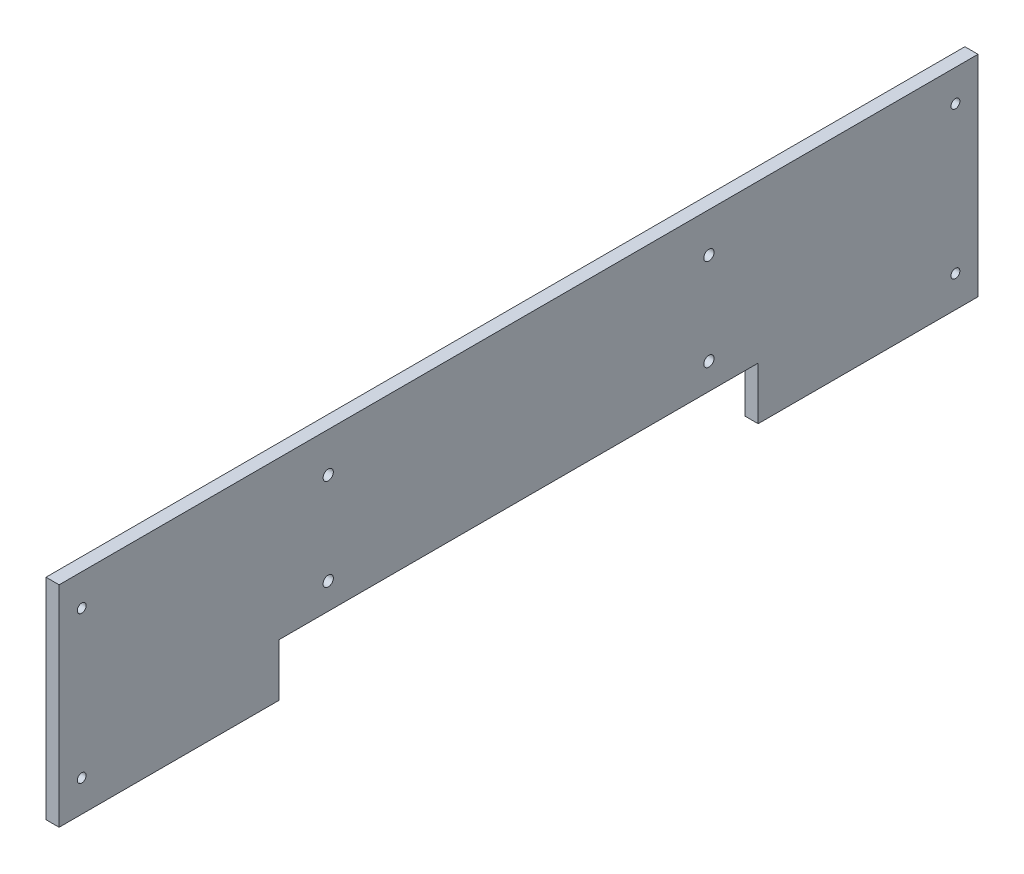
ISO-10303-21;
HEADER;
FILE_DESCRIPTION(('STEP AP214'),'2;1');
FILE_NAME('part.step','',(''),(''),'','','');
FILE_SCHEMA(('AUTOMOTIVE_DESIGN { 1 0 10303 214 1 1 1 1 }'));
ENDSEC;
DATA;
#1=APPLICATION_CONTEXT('core data for automotive mechanical design processes');
#2=APPLICATION_PROTOCOL_DEFINITION('international standard','automotive_design',2000,#1);
#3=PRODUCT_CONTEXT('',#1,'mechanical');
#4=PRODUCT('Part','Part','',(#3));
#5=PRODUCT_RELATED_PRODUCT_CATEGORY('part','',(#4));
#6=PRODUCT_DEFINITION_FORMATION('','',#4);
#7=PRODUCT_DEFINITION_CONTEXT('part definition',#1,'design');
#8=PRODUCT_DEFINITION('design','',#6,#7);
#9=PRODUCT_DEFINITION_SHAPE('','',#8);
#10=(LENGTH_UNIT() NAMED_UNIT(*) SI_UNIT(.MILLI.,.METRE.));
#11=(NAMED_UNIT(*) PLANE_ANGLE_UNIT() SI_UNIT($,.RADIAN.));
#12=(NAMED_UNIT(*) SI_UNIT($,.STERADIAN.) SOLID_ANGLE_UNIT());
#13=UNCERTAINTY_MEASURE_WITH_UNIT(LENGTH_MEASURE(1.E-05),#10,'distance_accuracy_value','');
#14=(GEOMETRIC_REPRESENTATION_CONTEXT(3) GLOBAL_UNCERTAINTY_ASSIGNED_CONTEXT((#13)) GLOBAL_UNIT_ASSIGNED_CONTEXT((#10,
#11,#12)) REPRESENTATION_CONTEXT('',''));
#15=CARTESIAN_POINT('',(0.,0.,0.));
#16=DIRECTION('',(0.,0.,1.));
#17=DIRECTION('',(1.,0.,0.));
#18=AXIS2_PLACEMENT_3D('',#15,#16,#17);
#19=CARTESIAN_POINT('',(6.35,-50.8,222.25));
#20=DIRECTION('',(0.,1.,0.));
#21=DIRECTION('',(0.,0.,1.));
#22=AXIS2_PLACEMENT_3D('',#19,#20,#21);
#23=PLANE('',#22);
#24=DIRECTION('',(0.,0.,-1.));
#25=VECTOR('',#24,1.);
#26=CARTESIAN_POINT('',(0.,-50.8,222.25));
#27=LINE('',#26,#25);
#28=CARTESIAN_POINT('',(0.,-50.8,222.25));
#29=VERTEX_POINT('',#28);
#30=CARTESIAN_POINT('',(0.,-50.8,115.8875));
#31=VERTEX_POINT('',#30);
#32=EDGE_CURVE('E128',#29,#31,#27,.T.);
#33=ORIENTED_EDGE('',*,*,#32,.T.);
#34=DIRECTION('',(1.,0.,0.));
#35=VECTOR('',#34,1.);
#36=CARTESIAN_POINT('',(0.,-50.8,115.8875));
#37=LINE('',#36,#35);
#38=CARTESIAN_POINT('',(6.35,-50.8,115.8875));
#39=VERTEX_POINT('',#38);
#40=EDGE_CURVE('E112',#31,#39,#37,.T.);
#41=ORIENTED_EDGE('',*,*,#40,.T.);
#42=DIRECTION('',(0.,0.,-1.));
#43=VECTOR('',#42,1.);
#44=CARTESIAN_POINT('',(6.35,-50.8,222.25));
#45=LINE('',#44,#43);
#46=CARTESIAN_POINT('',(6.35,-50.8,222.25));
#47=VERTEX_POINT('',#46);
#48=EDGE_CURVE('E145',#47,#39,#45,.T.);
#49=ORIENTED_EDGE('',*,*,#48,.F.);
#50=DIRECTION('',(-1.,0.,0.));
#51=VECTOR('',#50,1.);
#52=CARTESIAN_POINT('',(6.35,-50.8,222.25));
#53=LINE('',#52,#51);
#54=EDGE_CURVE('E135',#47,#29,#53,.T.);
#55=ORIENTED_EDGE('',*,*,#54,.T.);
#56=EDGE_LOOP('',(#33,#41,#49,#55));
#57=FACE_BOUND('',#56,.T.);
#58=ADVANCED_FACE('F37',(#57),#23,.F.);
#59=CARTESIAN_POINT('',(6.35,50.8,-222.25));
#60=DIRECTION('',(0.,0.,1.));
#61=DIRECTION('',(1.,0.,0.));
#62=AXIS2_PLACEMENT_3D('',#59,#60,#61);
#63=PLANE('',#62);
#64=DIRECTION('',(0.,1.,0.));
#65=VECTOR('',#64,1.);
#66=CARTESIAN_POINT('',(0.,50.8,-222.25));
#67=LINE('',#66,#65);
#68=CARTESIAN_POINT('',(0.,-50.8,-222.25));
#69=VERTEX_POINT('',#68);
#70=CARTESIAN_POINT('',(0.,50.8,-222.25));
#71=VERTEX_POINT('',#70);
#72=EDGE_CURVE('E153',#69,#71,#67,.T.);
#73=ORIENTED_EDGE('',*,*,#72,.T.);
#74=DIRECTION('',(-1.,0.,0.));
#75=VECTOR('',#74,1.);
#76=CARTESIAN_POINT('',(6.35,50.8,-222.25));
#77=LINE('',#76,#75);
#78=CARTESIAN_POINT('',(6.35,50.8,-222.25));
#79=VERTEX_POINT('',#78);
#80=EDGE_CURVE('E11',#79,#71,#77,.T.);
#81=ORIENTED_EDGE('',*,*,#80,.F.);
#82=DIRECTION('',(0.,1.,0.));
#83=VECTOR('',#82,1.);
#84=CARTESIAN_POINT('',(6.35,50.8,-222.25));
#85=LINE('',#84,#83);
#86=CARTESIAN_POINT('',(6.35,-50.8,-222.25));
#87=VERTEX_POINT('',#86);
#88=EDGE_CURVE('E136',#87,#79,#85,.T.);
#89=ORIENTED_EDGE('',*,*,#88,.F.);
#90=DIRECTION('',(-1.,0.,0.));
#91=VECTOR('',#90,1.);
#92=CARTESIAN_POINT('',(6.35,-50.8,-222.25));
#93=LINE('',#92,#91);
#94=EDGE_CURVE('E143',#87,#69,#93,.T.);
#95=ORIENTED_EDGE('',*,*,#94,.T.);
#96=EDGE_LOOP('',(#73,#81,#89,#95));
#97=FACE_BOUND('',#96,.T.);
#98=ADVANCED_FACE('F39',(#97),#63,.F.);
#99=CARTESIAN_POINT('',(6.35,50.8,222.25));
#100=DIRECTION('',(0.,-1.,0.));
#101=DIRECTION('',(0.,0.,-1.));
#102=AXIS2_PLACEMENT_3D('',#99,#100,#101);
#103=PLANE('',#102);
#104=DIRECTION('',(0.,0.,1.));
#105=VECTOR('',#104,1.);
#106=CARTESIAN_POINT('',(0.,50.8,222.25));
#107=LINE('',#106,#105);
#108=CARTESIAN_POINT('',(0.,50.8,222.25));
#109=VERTEX_POINT('',#108);
#110=EDGE_CURVE('E152',#71,#109,#107,.T.);
#111=ORIENTED_EDGE('',*,*,#110,.T.);
#112=DIRECTION('',(-1.,0.,0.));
#113=VECTOR('',#112,1.);
#114=CARTESIAN_POINT('',(6.35,50.8,222.25));
#115=LINE('',#114,#113);
#116=CARTESIAN_POINT('',(6.35,50.8,222.25));
#117=VERTEX_POINT('',#116);
#118=EDGE_CURVE('E45',#117,#109,#115,.T.);
#119=ORIENTED_EDGE('',*,*,#118,.F.);
#120=DIRECTION('',(0.,0.,1.));
#121=VECTOR('',#120,1.);
#122=CARTESIAN_POINT('',(6.35,50.8,222.25));
#123=LINE('',#122,#121);
#124=EDGE_CURVE('E90',#79,#117,#123,.T.);
#125=ORIENTED_EDGE('',*,*,#124,.F.);
#126=ORIENTED_EDGE('',*,*,#80,.T.);
#127=EDGE_LOOP('',(#111,#119,#125,#126));
#128=FACE_BOUND('',#127,.T.);
#129=ADVANCED_FACE('F244',(#128),#103,.F.);
#130=CARTESIAN_POINT('',(6.35,50.8,222.25));
#131=DIRECTION('',(0.,0.,-1.));
#132=DIRECTION('',(-1.,0.,0.));
#133=AXIS2_PLACEMENT_3D('',#130,#131,#132);
#134=PLANE('',#133);
#135=DIRECTION('',(0.,-1.,0.));
#136=VECTOR('',#135,1.);
#137=CARTESIAN_POINT('',(0.,50.8,222.25));
#138=LINE('',#137,#136);
#139=EDGE_CURVE('E139',#109,#29,#138,.T.);
#140=ORIENTED_EDGE('',*,*,#139,.T.);
#141=ORIENTED_EDGE('',*,*,#54,.F.);
#142=DIRECTION('',(0.,-1.,0.));
#143=VECTOR('',#142,1.);
#144=CARTESIAN_POINT('',(6.35,50.8,222.25));
#145=LINE('',#144,#143);
#146=EDGE_CURVE('E150',#117,#47,#145,.T.);
#147=ORIENTED_EDGE('',*,*,#146,.F.);
#148=ORIENTED_EDGE('',*,*,#118,.T.);
#149=EDGE_LOOP('',(#140,#141,#147,#148));
#150=FACE_BOUND('',#149,.T.);
#151=ADVANCED_FACE('F149',(#150),#134,.F.);
#152=CARTESIAN_POINT('',(6.35,-50.8,-115.8875));
#153=VERTEX_POINT('',#152);
#154=EDGE_CURVE('E61',#153,#87,#45,.T.);
#155=ORIENTED_EDGE('',*,*,#154,.F.);
#156=DIRECTION('',(1.,0.,0.));
#157=VECTOR('',#156,1.);
#158=CARTESIAN_POINT('',(0.,-50.8,-115.8875));
#159=LINE('',#158,#157);
#160=CARTESIAN_POINT('',(0.,-50.8,-115.8875));
#161=VERTEX_POINT('',#160);
#162=EDGE_CURVE('E122',#161,#153,#159,.T.);
#163=ORIENTED_EDGE('',*,*,#162,.F.);
#164=EDGE_CURVE('E83',#161,#69,#27,.T.);
#165=ORIENTED_EDGE('',*,*,#164,.T.);
#166=ORIENTED_EDGE('',*,*,#94,.F.);
#167=EDGE_LOOP('',(#155,#163,#165,#166));
#168=FACE_BOUND('',#167,.T.);
#169=ADVANCED_FACE('F222',(#168),#23,.F.);
#170=CARTESIAN_POINT('',(6.35,0.,0.));
#171=DIRECTION('',(1.,0.,0.));
#172=DIRECTION('',(0.,0.,-1.));
#173=AXIS2_PLACEMENT_3D('',#170,#171,#172);
#174=PLANE('',#173);
#175=DIRECTION('',(0.,-1.,0.));
#176=VECTOR('',#175,1.);
#177=CARTESIAN_POINT('',(6.35,-50.8,115.8875));
#178=LINE('',#177,#176);
#179=CARTESIAN_POINT('',(6.35,-25.4,115.8875));
#180=VERTEX_POINT('',#179);
#181=EDGE_CURVE('E117',#180,#39,#178,.T.);
#182=ORIENTED_EDGE('',*,*,#181,.F.);
#183=DIRECTION('',(0.,0.,1.));
#184=VECTOR('',#183,1.);
#185=CARTESIAN_POINT('',(6.35,-25.4,115.8875));
#186=LINE('',#185,#184);
#187=CARTESIAN_POINT('',(6.35,-25.4,-115.8875));
#188=VERTEX_POINT('',#187);
#189=EDGE_CURVE('E131',#188,#180,#186,.T.);
#190=ORIENTED_EDGE('',*,*,#189,.F.);
#191=DIRECTION('',(0.,1.,0.));
#192=VECTOR('',#191,1.);
#193=CARTESIAN_POINT('',(6.35,-50.8,-115.8875));
#194=LINE('',#193,#192);
#195=EDGE_CURVE('E215',#153,#188,#194,.T.);
#196=ORIENTED_EDGE('',*,*,#195,.F.);
#197=ORIENTED_EDGE('',*,*,#154,.T.);
#198=ORIENTED_EDGE('',*,*,#88,.T.);
#199=ORIENTED_EDGE('',*,*,#124,.T.);
#200=ORIENTED_EDGE('',*,*,#146,.T.);
#201=ORIENTED_EDGE('',*,*,#48,.T.);
#202=EDGE_LOOP('',(#182,#190,#196,#197,#198,#199,#200,#201));
#203=FACE_BOUND('',#202,.T.);
#204=CARTESIAN_POINT('',(6.35,35.56,211.328));
#205=DIRECTION('',(1.,0.,0.));
#206=DIRECTION('',(0.,0.,-1.));
#207=AXIS2_PLACEMENT_3D('',#204,#205,#206);
#208=CIRCLE('',#207,2.15265);
#209=CARTESIAN_POINT('',(6.35,35.56,209.17535));
#210=VERTEX_POINT('',#209);
#211=EDGE_CURVE('E205',#210,#210,#208,.T.);
#212=ORIENTED_EDGE('',*,*,#211,.F.);
#213=EDGE_LOOP('',(#212));
#214=FACE_BOUND('',#213,.T.);
#215=CARTESIAN_POINT('',(6.35,-35.56,211.328));
#216=DIRECTION('',(1.,0.,0.));
#217=DIRECTION('',(0.,0.,-1.));
#218=AXIS2_PLACEMENT_3D('',#215,#216,#217);
#219=CIRCLE('',#218,2.15265);
#220=CARTESIAN_POINT('',(6.35,-35.56,209.17535));
#221=VERTEX_POINT('',#220);
#222=EDGE_CURVE('E199',#221,#221,#219,.T.);
#223=ORIENTED_EDGE('',*,*,#222,.F.);
#224=EDGE_LOOP('',(#223));
#225=FACE_BOUND('',#224,.T.);
#226=CARTESIAN_POINT('',(6.35,-35.56,-211.328));
#227=DIRECTION('',(1.,0.,0.));
#228=DIRECTION('',(0.,0.,-1.));
#229=AXIS2_PLACEMENT_3D('',#226,#227,#228);
#230=CIRCLE('',#229,2.15265);
#231=CARTESIAN_POINT('',(6.35,-35.56,-213.48065));
#232=VERTEX_POINT('',#231);
#233=EDGE_CURVE('E193',#232,#232,#230,.T.);
#234=ORIENTED_EDGE('',*,*,#233,.F.);
#235=EDGE_LOOP('',(#234));
#236=FACE_BOUND('',#235,.T.);
#237=CARTESIAN_POINT('',(6.35,35.56,-211.328));
#238=DIRECTION('',(1.,0.,0.));
#239=DIRECTION('',(0.,0.,-1.));
#240=AXIS2_PLACEMENT_3D('',#237,#238,#239);
#241=CIRCLE('',#240,2.15265);
#242=CARTESIAN_POINT('',(6.35,35.56,-213.48065));
#243=VERTEX_POINT('',#242);
#244=EDGE_CURVE('E187',#243,#243,#241,.T.);
#245=ORIENTED_EDGE('',*,*,#244,.F.);
#246=EDGE_LOOP('',(#245));
#247=FACE_BOUND('',#246,.T.);
#248=CARTESIAN_POINT('',(6.35,31.75,-92.075));
#249=DIRECTION('',(1.,0.,0.));
#250=DIRECTION('',(0.,0.,-1.));
#251=AXIS2_PLACEMENT_3D('',#248,#249,#250);
#252=CIRCLE('',#251,2.48919999999999);
#253=CARTESIAN_POINT('',(6.35,31.75,-94.5642));
#254=VERTEX_POINT('',#253);
#255=EDGE_CURVE('E181',#254,#254,#252,.T.);
#256=ORIENTED_EDGE('',*,*,#255,.F.);
#257=EDGE_LOOP('',(#256));
#258=FACE_BOUND('',#257,.T.);
#259=CARTESIAN_POINT('',(6.35,-12.7,-92.075));
#260=DIRECTION('',(1.,0.,0.));
#261=DIRECTION('',(0.,0.,-1.));
#262=AXIS2_PLACEMENT_3D('',#259,#260,#261);
#263=CIRCLE('',#262,2.48919999999999);
#264=CARTESIAN_POINT('',(6.35,-12.7,-94.5642));
#265=VERTEX_POINT('',#264);
#266=EDGE_CURVE('E175',#265,#265,#263,.T.);
#267=ORIENTED_EDGE('',*,*,#266,.F.);
#268=EDGE_LOOP('',(#267));
#269=FACE_BOUND('',#268,.T.);
#270=CARTESIAN_POINT('',(6.35,31.75,92.075));
#271=DIRECTION('',(1.,0.,0.));
#272=DIRECTION('',(0.,0.,-1.));
#273=AXIS2_PLACEMENT_3D('',#270,#271,#272);
#274=CIRCLE('',#273,2.48919999999999);
#275=CARTESIAN_POINT('',(6.35,31.75,89.5858));
#276=VERTEX_POINT('',#275);
#277=EDGE_CURVE('E169',#276,#276,#274,.T.);
#278=ORIENTED_EDGE('',*,*,#277,.F.);
#279=EDGE_LOOP('',(#278));
#280=FACE_BOUND('',#279,.T.);
#281=CARTESIAN_POINT('',(6.35,-12.7,92.075));
#282=DIRECTION('',(1.,0.,0.));
#283=DIRECTION('',(0.,0.,-1.));
#284=AXIS2_PLACEMENT_3D('',#281,#282,#283);
#285=CIRCLE('',#284,2.48919999999999);
#286=CARTESIAN_POINT('',(6.35,-12.7,89.5858));
#287=VERTEX_POINT('',#286);
#288=EDGE_CURVE('E163',#287,#287,#285,.T.);
#289=ORIENTED_EDGE('',*,*,#288,.F.);
#290=EDGE_LOOP('',(#289));
#291=FACE_BOUND('',#290,.T.);
#292=ADVANCED_FACE('F226',(#203,#214,#225,#236,#247,#258,#269,#280,#291),#174,.T.);
#293=CARTESIAN_POINT('',(0.,0.,0.));
#294=DIRECTION('',(1.,0.,0.));
#295=DIRECTION('',(0.,0.,-1.));
#296=AXIS2_PLACEMENT_3D('',#293,#294,#295);
#297=PLANE('',#296);
#298=CARTESIAN_POINT('',(0.,35.56,211.328));
#299=DIRECTION('',(1.,0.,0.));
#300=DIRECTION('',(0.,0.,-1.));
#301=AXIS2_PLACEMENT_3D('',#298,#299,#300);
#302=CIRCLE('',#301,2.15265);
#303=CARTESIAN_POINT('',(0.,35.56,209.17535));
#304=VERTEX_POINT('',#303);
#305=EDGE_CURVE('E202',#304,#304,#302,.T.);
#306=ORIENTED_EDGE('',*,*,#305,.T.);
#307=EDGE_LOOP('',(#306));
#308=FACE_BOUND('',#307,.T.);
#309=CARTESIAN_POINT('',(0.,-35.56,211.328));
#310=DIRECTION('',(1.,0.,0.));
#311=DIRECTION('',(0.,0.,-1.));
#312=AXIS2_PLACEMENT_3D('',#309,#310,#311);
#313=CIRCLE('',#312,2.15265);
#314=CARTESIAN_POINT('',(0.,-35.56,209.17535));
#315=VERTEX_POINT('',#314);
#316=EDGE_CURVE('E196',#315,#315,#313,.T.);
#317=ORIENTED_EDGE('',*,*,#316,.T.);
#318=EDGE_LOOP('',(#317));
#319=FACE_BOUND('',#318,.T.);
#320=CARTESIAN_POINT('',(0.,-35.56,-211.328));
#321=DIRECTION('',(1.,0.,0.));
#322=DIRECTION('',(0.,0.,-1.));
#323=AXIS2_PLACEMENT_3D('',#320,#321,#322);
#324=CIRCLE('',#323,2.15265);
#325=CARTESIAN_POINT('',(0.,-35.56,-213.48065));
#326=VERTEX_POINT('',#325);
#327=EDGE_CURVE('E190',#326,#326,#324,.T.);
#328=ORIENTED_EDGE('',*,*,#327,.T.);
#329=EDGE_LOOP('',(#328));
#330=FACE_BOUND('',#329,.T.);
#331=CARTESIAN_POINT('',(0.,35.56,-211.328));
#332=DIRECTION('',(1.,0.,0.));
#333=DIRECTION('',(0.,0.,-1.));
#334=AXIS2_PLACEMENT_3D('',#331,#332,#333);
#335=CIRCLE('',#334,2.15265);
#336=CARTESIAN_POINT('',(0.,35.56,-213.48065));
#337=VERTEX_POINT('',#336);
#338=EDGE_CURVE('E184',#337,#337,#335,.T.);
#339=ORIENTED_EDGE('',*,*,#338,.T.);
#340=EDGE_LOOP('',(#339));
#341=FACE_BOUND('',#340,.T.);
#342=CARTESIAN_POINT('',(0.,31.75,-92.075));
#343=DIRECTION('',(1.,0.,0.));
#344=DIRECTION('',(0.,0.,-1.));
#345=AXIS2_PLACEMENT_3D('',#342,#343,#344);
#346=CIRCLE('',#345,2.48919999999999);
#347=CARTESIAN_POINT('',(0.,31.75,-94.5642));
#348=VERTEX_POINT('',#347);
#349=EDGE_CURVE('E178',#348,#348,#346,.T.);
#350=ORIENTED_EDGE('',*,*,#349,.T.);
#351=EDGE_LOOP('',(#350));
#352=FACE_BOUND('',#351,.T.);
#353=CARTESIAN_POINT('',(0.,-12.7,-92.075));
#354=DIRECTION('',(1.,0.,0.));
#355=DIRECTION('',(0.,0.,-1.));
#356=AXIS2_PLACEMENT_3D('',#353,#354,#355);
#357=CIRCLE('',#356,2.48919999999999);
#358=CARTESIAN_POINT('',(0.,-12.7,-94.5642));
#359=VERTEX_POINT('',#358);
#360=EDGE_CURVE('E172',#359,#359,#357,.T.);
#361=ORIENTED_EDGE('',*,*,#360,.T.);
#362=EDGE_LOOP('',(#361));
#363=FACE_BOUND('',#362,.T.);
#364=CARTESIAN_POINT('',(0.,31.75,92.075));
#365=DIRECTION('',(1.,0.,0.));
#366=DIRECTION('',(0.,0.,-1.));
#367=AXIS2_PLACEMENT_3D('',#364,#365,#366);
#368=CIRCLE('',#367,2.48919999999999);
#369=CARTESIAN_POINT('',(0.,31.75,89.5858));
#370=VERTEX_POINT('',#369);
#371=EDGE_CURVE('E166',#370,#370,#368,.T.);
#372=ORIENTED_EDGE('',*,*,#371,.T.);
#373=EDGE_LOOP('',(#372));
#374=FACE_BOUND('',#373,.T.);
#375=CARTESIAN_POINT('',(0.,-12.7,92.075));
#376=DIRECTION('',(1.,0.,0.));
#377=DIRECTION('',(0.,0.,-1.));
#378=AXIS2_PLACEMENT_3D('',#375,#376,#377);
#379=CIRCLE('',#378,2.48919999999999);
#380=CARTESIAN_POINT('',(0.,-12.7,89.5858));
#381=VERTEX_POINT('',#380);
#382=EDGE_CURVE('E155',#381,#381,#379,.T.);
#383=ORIENTED_EDGE('',*,*,#382,.T.);
#384=EDGE_LOOP('',(#383));
#385=FACE_BOUND('',#384,.T.);
#386=DIRECTION('',(0.,0.,1.));
#387=VECTOR('',#386,1.);
#388=CARTESIAN_POINT('',(0.,-25.4,115.8875));
#389=LINE('',#388,#387);
#390=CARTESIAN_POINT('',(0.,-25.4,-115.8875));
#391=VERTEX_POINT('',#390);
#392=CARTESIAN_POINT('',(0.,-25.4,115.8875));
#393=VERTEX_POINT('',#392);
#394=EDGE_CURVE('E52',#391,#393,#389,.T.);
#395=ORIENTED_EDGE('',*,*,#394,.T.);
#396=DIRECTION('',(0.,-1.,0.));
#397=VECTOR('',#396,1.);
#398=CARTESIAN_POINT('',(0.,-50.8,115.8875));
#399=LINE('',#398,#397);
#400=EDGE_CURVE('E115',#393,#31,#399,.T.);
#401=ORIENTED_EDGE('',*,*,#400,.T.);
#402=ORIENTED_EDGE('',*,*,#32,.F.);
#403=ORIENTED_EDGE('',*,*,#139,.F.);
#404=ORIENTED_EDGE('',*,*,#110,.F.);
#405=ORIENTED_EDGE('',*,*,#72,.F.);
#406=ORIENTED_EDGE('',*,*,#164,.F.);
#407=DIRECTION('',(0.,1.,0.));
#408=VECTOR('',#407,1.);
#409=CARTESIAN_POINT('',(0.,-50.8,-115.8875));
#410=LINE('',#409,#408);
#411=EDGE_CURVE('E130',#161,#391,#410,.T.);
#412=ORIENTED_EDGE('',*,*,#411,.T.);
#413=EDGE_LOOP('',(#395,#401,#402,#403,#404,#405,#406,#412));
#414=FACE_BOUND('',#413,.T.);
#415=ADVANCED_FACE('F126',(#308,#319,#330,#341,#352,#363,#374,#385,#414),#297,.F.);
#416=CARTESIAN_POINT('',(6.35,-12.7,92.075));
#417=DIRECTION('',(1.,0.,0.));
#418=DIRECTION('',(0.,0.,-1.));
#419=AXIS2_PLACEMENT_3D('',#416,#417,#418);
#420=CYLINDRICAL_SURFACE('',#419,2.48919999999999);
#421=ORIENTED_EDGE('',*,*,#382,.F.);
#422=EDGE_LOOP('',(#421));
#423=FACE_BOUND('',#422,.T.);
#424=ORIENTED_EDGE('',*,*,#288,.T.);
#425=EDGE_LOOP('',(#424));
#426=FACE_BOUND('',#425,.T.);
#427=ADVANCED_FACE('F299',(#423,#426),#420,.F.);
#428=CARTESIAN_POINT('',(6.35,31.75,92.075));
#429=DIRECTION('',(1.,0.,0.));
#430=DIRECTION('',(0.,0.,-1.));
#431=AXIS2_PLACEMENT_3D('',#428,#429,#430);
#432=CYLINDRICAL_SURFACE('',#431,2.48919999999999);
#433=ORIENTED_EDGE('',*,*,#371,.F.);
#434=EDGE_LOOP('',(#433));
#435=FACE_BOUND('',#434,.T.);
#436=ORIENTED_EDGE('',*,*,#277,.T.);
#437=EDGE_LOOP('',(#436));
#438=FACE_BOUND('',#437,.T.);
#439=ADVANCED_FACE('F309',(#435,#438),#432,.F.);
#440=CARTESIAN_POINT('',(6.35,-12.7,-92.075));
#441=DIRECTION('',(1.,0.,0.));
#442=DIRECTION('',(0.,0.,-1.));
#443=AXIS2_PLACEMENT_3D('',#440,#441,#442);
#444=CYLINDRICAL_SURFACE('',#443,2.48919999999999);
#445=ORIENTED_EDGE('',*,*,#360,.F.);
#446=EDGE_LOOP('',(#445));
#447=FACE_BOUND('',#446,.T.);
#448=ORIENTED_EDGE('',*,*,#266,.T.);
#449=EDGE_LOOP('',(#448));
#450=FACE_BOUND('',#449,.T.);
#451=ADVANCED_FACE('F320',(#447,#450),#444,.F.);
#452=CARTESIAN_POINT('',(6.35,31.75,-92.075));
#453=DIRECTION('',(1.,0.,0.));
#454=DIRECTION('',(0.,0.,-1.));
#455=AXIS2_PLACEMENT_3D('',#452,#453,#454);
#456=CYLINDRICAL_SURFACE('',#455,2.48919999999999);
#457=ORIENTED_EDGE('',*,*,#349,.F.);
#458=EDGE_LOOP('',(#457));
#459=FACE_BOUND('',#458,.T.);
#460=ORIENTED_EDGE('',*,*,#255,.T.);
#461=EDGE_LOOP('',(#460));
#462=FACE_BOUND('',#461,.T.);
#463=ADVANCED_FACE('F331',(#459,#462),#456,.F.);
#464=CARTESIAN_POINT('',(6.35,35.56,-211.328));
#465=DIRECTION('',(1.,0.,0.));
#466=DIRECTION('',(0.,0.,-1.));
#467=AXIS2_PLACEMENT_3D('',#464,#465,#466);
#468=CYLINDRICAL_SURFACE('',#467,2.15265);
#469=ORIENTED_EDGE('',*,*,#338,.F.);
#470=EDGE_LOOP('',(#469));
#471=FACE_BOUND('',#470,.T.);
#472=ORIENTED_EDGE('',*,*,#244,.T.);
#473=EDGE_LOOP('',(#472));
#474=FACE_BOUND('',#473,.T.);
#475=ADVANCED_FACE('F342',(#471,#474),#468,.F.);
#476=CARTESIAN_POINT('',(6.35,-35.56,-211.328));
#477=DIRECTION('',(1.,0.,0.));
#478=DIRECTION('',(0.,0.,-1.));
#479=AXIS2_PLACEMENT_3D('',#476,#477,#478);
#480=CYLINDRICAL_SURFACE('',#479,2.15265);
#481=ORIENTED_EDGE('',*,*,#327,.F.);
#482=EDGE_LOOP('',(#481));
#483=FACE_BOUND('',#482,.T.);
#484=ORIENTED_EDGE('',*,*,#233,.T.);
#485=EDGE_LOOP('',(#484));
#486=FACE_BOUND('',#485,.T.);
#487=ADVANCED_FACE('F353',(#483,#486),#480,.F.);
#488=CARTESIAN_POINT('',(6.35,-35.56,211.328));
#489=DIRECTION('',(1.,0.,0.));
#490=DIRECTION('',(0.,0.,-1.));
#491=AXIS2_PLACEMENT_3D('',#488,#489,#490);
#492=CYLINDRICAL_SURFACE('',#491,2.15265);
#493=ORIENTED_EDGE('',*,*,#316,.F.);
#494=EDGE_LOOP('',(#493));
#495=FACE_BOUND('',#494,.T.);
#496=ORIENTED_EDGE('',*,*,#222,.T.);
#497=EDGE_LOOP('',(#496));
#498=FACE_BOUND('',#497,.T.);
#499=ADVANCED_FACE('F364',(#495,#498),#492,.F.);
#500=CARTESIAN_POINT('',(6.35,35.56,211.328));
#501=DIRECTION('',(1.,0.,0.));
#502=DIRECTION('',(0.,0.,-1.));
#503=AXIS2_PLACEMENT_3D('',#500,#501,#502);
#504=CYLINDRICAL_SURFACE('',#503,2.15265);
#505=ORIENTED_EDGE('',*,*,#305,.F.);
#506=EDGE_LOOP('',(#505));
#507=FACE_BOUND('',#506,.T.);
#508=ORIENTED_EDGE('',*,*,#211,.T.);
#509=EDGE_LOOP('',(#508));
#510=FACE_BOUND('',#509,.T.);
#511=ADVANCED_FACE('F237',(#507,#510),#504,.F.);
#512=CARTESIAN_POINT('',(0.,-50.8,115.8875));
#513=DIRECTION('',(0.,0.,1.));
#514=DIRECTION('',(0.,-1.,0.));
#515=AXIS2_PLACEMENT_3D('',#512,#513,#514);
#516=PLANE('',#515);
#517=ORIENTED_EDGE('',*,*,#181,.T.);
#518=ORIENTED_EDGE('',*,*,#40,.F.);
#519=ORIENTED_EDGE('',*,*,#400,.F.);
#520=DIRECTION('',(1.,0.,0.));
#521=VECTOR('',#520,1.);
#522=CARTESIAN_POINT('',(0.,-25.4,115.8875));
#523=LINE('',#522,#521);
#524=EDGE_CURVE('E207',#393,#180,#523,.T.);
#525=ORIENTED_EDGE('',*,*,#524,.T.);
#526=EDGE_LOOP('',(#517,#518,#519,#525));
#527=FACE_BOUND('',#526,.T.);
#528=ADVANCED_FACE('F114',(#527),#516,.F.);
#529=CARTESIAN_POINT('',(0.,-25.4,115.8875));
#530=DIRECTION('',(0.,1.,0.));
#531=DIRECTION('',(0.,0.,1.));
#532=AXIS2_PLACEMENT_3D('',#529,#530,#531);
#533=PLANE('',#532);
#534=ORIENTED_EDGE('',*,*,#189,.T.);
#535=ORIENTED_EDGE('',*,*,#524,.F.);
#536=ORIENTED_EDGE('',*,*,#394,.F.);
#537=DIRECTION('',(1.,0.,0.));
#538=VECTOR('',#537,1.);
#539=CARTESIAN_POINT('',(0.,-25.4,-115.8875));
#540=LINE('',#539,#538);
#541=EDGE_CURVE('E210',#391,#188,#540,.T.);
#542=ORIENTED_EDGE('',*,*,#541,.T.);
#543=EDGE_LOOP('',(#534,#535,#536,#542));
#544=FACE_BOUND('',#543,.T.);
#545=ADVANCED_FACE('F229',(#544),#533,.F.);
#546=CARTESIAN_POINT('',(0.,-50.8,-115.8875));
#547=DIRECTION('',(0.,0.,-1.));
#548=DIRECTION('',(0.,1.,0.));
#549=AXIS2_PLACEMENT_3D('',#546,#547,#548);
#550=PLANE('',#549);
#551=ORIENTED_EDGE('',*,*,#195,.T.);
#552=ORIENTED_EDGE('',*,*,#541,.F.);
#553=ORIENTED_EDGE('',*,*,#411,.F.);
#554=ORIENTED_EDGE('',*,*,#162,.T.);
#555=EDGE_LOOP('',(#551,#552,#553,#554));
#556=FACE_BOUND('',#555,.T.);
#557=ADVANCED_FACE('F221',(#556),#550,.F.);
#558=CLOSED_SHELL('',(#58,#98,#129,#151,#169,#292,#415,#427,#439,#451,#463,#475,#487,#499,#511,
#528,#545,#557));
#559=MANIFOLD_SOLID_BREP('B2',#558);
#560=ADVANCED_BREP_SHAPE_REPRESENTATION('',(#18,#559),#14);
#561=SHAPE_DEFINITION_REPRESENTATION(#9,#560);
ENDSEC;
END-ISO-10303-21;
